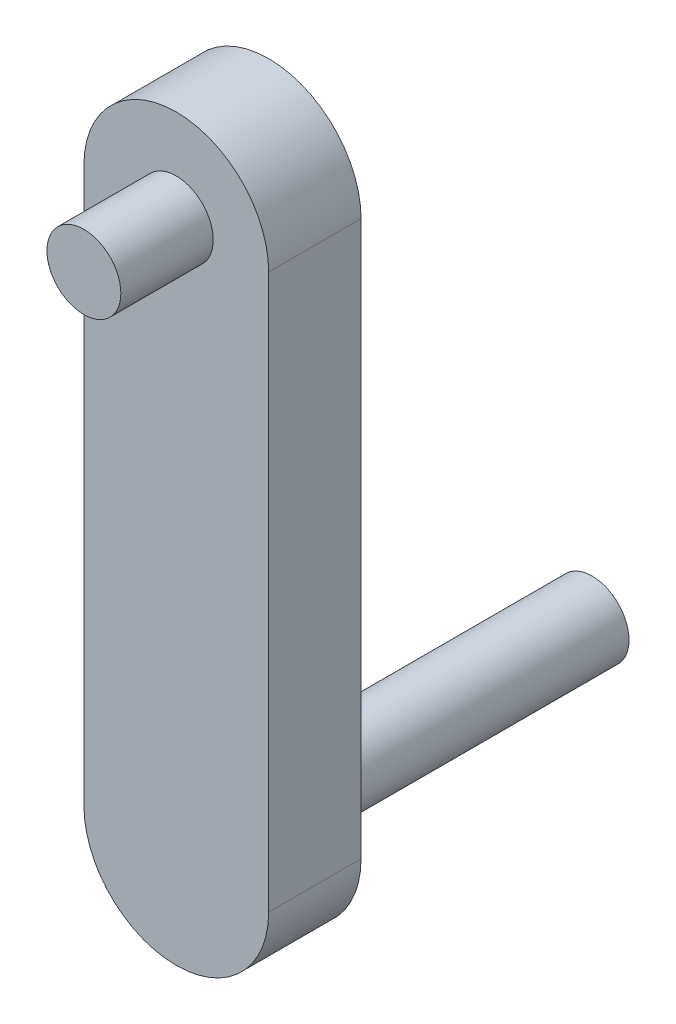
ISO-10303-21;
HEADER;
FILE_DESCRIPTION(('STEP AP214'),'2;1');
FILE_NAME('part.step','',(''),(''),'','','');
FILE_SCHEMA(('AUTOMOTIVE_DESIGN { 1 0 10303 214 1 1 1 1 }'));
ENDSEC;
DATA;
#1=APPLICATION_CONTEXT('core data for automotive mechanical design processes');
#2=APPLICATION_PROTOCOL_DEFINITION('international standard','automotive_design',2000,#1);
#3=PRODUCT_CONTEXT('',#1,'mechanical');
#4=PRODUCT('Part','Part','',(#3));
#5=PRODUCT_RELATED_PRODUCT_CATEGORY('part','',(#4));
#6=PRODUCT_DEFINITION_FORMATION('','',#4);
#7=PRODUCT_DEFINITION_CONTEXT('part definition',#1,'design');
#8=PRODUCT_DEFINITION('design','',#6,#7);
#9=PRODUCT_DEFINITION_SHAPE('','',#8);
#10=(LENGTH_UNIT() NAMED_UNIT(*) SI_UNIT(.MILLI.,.METRE.));
#11=(NAMED_UNIT(*) PLANE_ANGLE_UNIT() SI_UNIT($,.RADIAN.));
#12=(NAMED_UNIT(*) SI_UNIT($,.STERADIAN.) SOLID_ANGLE_UNIT());
#13=UNCERTAINTY_MEASURE_WITH_UNIT(LENGTH_MEASURE(1.E-05),#10,'distance_accuracy_value','');
#14=(GEOMETRIC_REPRESENTATION_CONTEXT(3) GLOBAL_UNCERTAINTY_ASSIGNED_CONTEXT((#13)) GLOBAL_UNIT_ASSIGNED_CONTEXT((#10,
#11,#12)) REPRESENTATION_CONTEXT('',''));
#15=CARTESIAN_POINT('',(0.,0.,0.));
#16=DIRECTION('',(0.,0.,1.));
#17=DIRECTION('',(1.,0.,0.));
#18=AXIS2_PLACEMENT_3D('',#15,#16,#17);
#19=CARTESIAN_POINT('',(0.,-30.,10.));
#20=DIRECTION('',(0.,0.,1.));
#21=DIRECTION('',(1.,0.,0.));
#22=AXIS2_PLACEMENT_3D('',#19,#20,#21);
#23=PLANE('',#22);
#24=CARTESIAN_POINT('',(0.,30.,10.));
#25=DIRECTION('',(0.,0.,1.));
#26=DIRECTION('',(1.,0.,0.));
#27=AXIS2_PLACEMENT_3D('',#24,#25,#26);
#28=CIRCLE('',#27,4.);
#29=CARTESIAN_POINT('',(4.,30.,10.));
#30=VERTEX_POINT('',#29);
#31=EDGE_CURVE('E115',#30,#30,#28,.T.);
#32=ORIENTED_EDGE('',*,*,#31,.F.);
#33=EDGE_LOOP('',(#32));
#34=FACE_BOUND('',#33,.T.);
#35=CARTESIAN_POINT('',(0.,-30.,10.));
#36=DIRECTION('',(0.,0.,1.));
#37=DIRECTION('',(1.,0.,0.));
#38=AXIS2_PLACEMENT_3D('',#35,#36,#37);
#39=CIRCLE('',#38,10.);
#40=CARTESIAN_POINT('',(-10.,-30.,10.));
#41=VERTEX_POINT('',#40);
#42=CARTESIAN_POINT('',(10.,-30.,10.));
#43=VERTEX_POINT('',#42);
#44=EDGE_CURVE('E95',#41,#43,#39,.T.);
#45=ORIENTED_EDGE('',*,*,#44,.T.);
#46=DIRECTION('',(0.,1.,0.));
#47=VECTOR('',#46,1.);
#48=CARTESIAN_POINT('',(10.,30.,10.));
#49=LINE('',#48,#47);
#50=CARTESIAN_POINT('',(10.,30.,10.));
#51=VERTEX_POINT('',#50);
#52=EDGE_CURVE('E91',#43,#51,#49,.T.);
#53=ORIENTED_EDGE('',*,*,#52,.T.);
#54=CARTESIAN_POINT('',(0.,30.,10.));
#55=DIRECTION('',(0.,0.,1.));
#56=DIRECTION('',(-1.,0.,0.));
#57=AXIS2_PLACEMENT_3D('',#54,#55,#56);
#58=CIRCLE('',#57,10.);
#59=CARTESIAN_POINT('',(-10.,30.,10.));
#60=VERTEX_POINT('',#59);
#61=EDGE_CURVE('E93',#51,#60,#58,.T.);
#62=ORIENTED_EDGE('',*,*,#61,.T.);
#63=DIRECTION('',(0.,-1.,0.));
#64=VECTOR('',#63,1.);
#65=CARTESIAN_POINT('',(-10.,30.,10.));
#66=LINE('',#65,#64);
#67=EDGE_CURVE('E61',#60,#41,#66,.T.);
#68=ORIENTED_EDGE('',*,*,#67,.T.);
#69=EDGE_LOOP('',(#45,#53,#62,#68));
#70=FACE_BOUND('',#69,.T.);
#71=ADVANCED_FACE('F43',(#34,#70),#23,.T.);
#72=CARTESIAN_POINT('',(0.,-30.,0.));
#73=DIRECTION('',(0.,0.,1.));
#74=DIRECTION('',(1.,0.,0.));
#75=AXIS2_PLACEMENT_3D('',#72,#73,#74);
#76=PLANE('',#75);
#77=CARTESIAN_POINT('',(0.,-30.,0.));
#78=DIRECTION('',(0.,0.,1.));
#79=DIRECTION('',(1.,0.,0.));
#80=AXIS2_PLACEMENT_3D('',#77,#78,#79);
#81=CIRCLE('',#80,10.);
#82=CARTESIAN_POINT('',(-10.,-30.,0.));
#83=VERTEX_POINT('',#82);
#84=CARTESIAN_POINT('',(10.,-30.,0.));
#85=VERTEX_POINT('',#84);
#86=EDGE_CURVE('E111',#83,#85,#81,.T.);
#87=ORIENTED_EDGE('',*,*,#86,.F.);
#88=DIRECTION('',(0.,-1.,0.));
#89=VECTOR('',#88,1.);
#90=CARTESIAN_POINT('',(-10.,30.,0.));
#91=LINE('',#90,#89);
#92=CARTESIAN_POINT('',(-10.,30.,0.));
#93=VERTEX_POINT('',#92);
#94=EDGE_CURVE('E84',#93,#83,#91,.T.);
#95=ORIENTED_EDGE('',*,*,#94,.F.);
#96=CARTESIAN_POINT('',(0.,30.,0.));
#97=DIRECTION('',(0.,0.,1.));
#98=DIRECTION('',(-1.,0.,0.));
#99=AXIS2_PLACEMENT_3D('',#96,#97,#98);
#100=CIRCLE('',#99,10.);
#101=CARTESIAN_POINT('',(10.,30.,0.));
#102=VERTEX_POINT('',#101);
#103=EDGE_CURVE('E78',#102,#93,#100,.T.);
#104=ORIENTED_EDGE('',*,*,#103,.F.);
#105=DIRECTION('',(0.,1.,0.));
#106=VECTOR('',#105,1.);
#107=CARTESIAN_POINT('',(10.,30.,0.));
#108=LINE('',#107,#106);
#109=EDGE_CURVE('E100',#85,#102,#108,.T.);
#110=ORIENTED_EDGE('',*,*,#109,.F.);
#111=EDGE_LOOP('',(#87,#95,#104,#110));
#112=FACE_BOUND('',#111,.T.);
#113=CARTESIAN_POINT('',(0.,-30.,0.));
#114=DIRECTION('',(0.,0.,1.));
#115=DIRECTION('',(1.,0.,0.));
#116=AXIS2_PLACEMENT_3D('',#113,#114,#115);
#117=CIRCLE('',#116,4.);
#118=CARTESIAN_POINT('',(4.00000000000001,-30.,0.));
#119=VERTEX_POINT('',#118);
#120=EDGE_CURVE('E140',#119,#119,#117,.F.);
#121=ORIENTED_EDGE('',*,*,#120,.F.);
#122=EDGE_LOOP('',(#121));
#123=FACE_BOUND('',#122,.T.);
#124=ADVANCED_FACE('F128',(#112,#123),#76,.F.);
#125=CARTESIAN_POINT('',(0.,-30.,10.));
#126=DIRECTION('',(0.,0.,-1.));
#127=DIRECTION('',(-1.,0.,0.));
#128=AXIS2_PLACEMENT_3D('',#125,#126,#127);
#129=CYLINDRICAL_SURFACE('',#128,10.);
#130=ORIENTED_EDGE('',*,*,#86,.T.);
#131=DIRECTION('',(0.,0.,-1.));
#132=VECTOR('',#131,1.);
#133=CARTESIAN_POINT('',(10.,-30.,10.));
#134=LINE('',#133,#132);
#135=EDGE_CURVE('E11',#43,#85,#134,.T.);
#136=ORIENTED_EDGE('',*,*,#135,.F.);
#137=ORIENTED_EDGE('',*,*,#44,.F.);
#138=DIRECTION('',(0.,0.,-1.));
#139=VECTOR('',#138,1.);
#140=CARTESIAN_POINT('',(-10.,-30.,10.));
#141=LINE('',#140,#139);
#142=EDGE_CURVE('E107',#41,#83,#141,.T.);
#143=ORIENTED_EDGE('',*,*,#142,.T.);
#144=EDGE_LOOP('',(#130,#136,#137,#143));
#145=FACE_BOUND('',#144,.T.);
#146=ADVANCED_FACE('F45',(#145),#129,.T.);
#147=CARTESIAN_POINT('',(10.,30.,10.));
#148=DIRECTION('',(-1.,0.,0.));
#149=DIRECTION('',(0.,-1.,0.));
#150=AXIS2_PLACEMENT_3D('',#147,#148,#149);
#151=PLANE('',#150);
#152=ORIENTED_EDGE('',*,*,#109,.T.);
#153=DIRECTION('',(0.,0.,-1.));
#154=VECTOR('',#153,1.);
#155=CARTESIAN_POINT('',(10.,30.,10.));
#156=LINE('',#155,#154);
#157=EDGE_CURVE('E53',#51,#102,#156,.T.);
#158=ORIENTED_EDGE('',*,*,#157,.F.);
#159=ORIENTED_EDGE('',*,*,#52,.F.);
#160=ORIENTED_EDGE('',*,*,#135,.T.);
#161=EDGE_LOOP('',(#152,#158,#159,#160));
#162=FACE_BOUND('',#161,.T.);
#163=ADVANCED_FACE('F99',(#162),#151,.F.);
#164=CARTESIAN_POINT('',(0.,30.,10.));
#165=DIRECTION('',(0.,0.,-1.));
#166=DIRECTION('',(-1.,0.,0.));
#167=AXIS2_PLACEMENT_3D('',#164,#165,#166);
#168=CYLINDRICAL_SURFACE('',#167,10.);
#169=ORIENTED_EDGE('',*,*,#103,.T.);
#170=DIRECTION('',(0.,0.,-1.));
#171=VECTOR('',#170,1.);
#172=CARTESIAN_POINT('',(-10.,30.,10.));
#173=LINE('',#172,#171);
#174=EDGE_CURVE('E102',#60,#93,#173,.T.);
#175=ORIENTED_EDGE('',*,*,#174,.F.);
#176=ORIENTED_EDGE('',*,*,#61,.F.);
#177=ORIENTED_EDGE('',*,*,#157,.T.);
#178=EDGE_LOOP('',(#169,#175,#176,#177));
#179=FACE_BOUND('',#178,.T.);
#180=ADVANCED_FACE('F103',(#179),#168,.T.);
#181=CARTESIAN_POINT('',(-10.,30.,10.));
#182=DIRECTION('',(1.,0.,0.));
#183=DIRECTION('',(0.,1.,0.));
#184=AXIS2_PLACEMENT_3D('',#181,#182,#183);
#185=PLANE('',#184);
#186=ORIENTED_EDGE('',*,*,#94,.T.);
#187=ORIENTED_EDGE('',*,*,#142,.F.);
#188=ORIENTED_EDGE('',*,*,#67,.F.);
#189=ORIENTED_EDGE('',*,*,#174,.T.);
#190=EDGE_LOOP('',(#186,#187,#188,#189));
#191=FACE_BOUND('',#190,.T.);
#192=ADVANCED_FACE('F125',(#191),#185,.F.);
#193=CARTESIAN_POINT('',(0.,30.,20.));
#194=DIRECTION('',(0.,0.,-1.));
#195=DIRECTION('',(-1.,0.,0.));
#196=AXIS2_PLACEMENT_3D('',#193,#194,#195);
#197=CYLINDRICAL_SURFACE('',#196,4.);
#198=ORIENTED_EDGE('',*,*,#31,.T.);
#199=EDGE_LOOP('',(#198));
#200=FACE_BOUND('',#199,.T.);
#201=CARTESIAN_POINT('',(0.,30.,20.));
#202=DIRECTION('',(0.,0.,1.));
#203=DIRECTION('',(1.,0.,0.));
#204=AXIS2_PLACEMENT_3D('',#201,#202,#203);
#205=CIRCLE('',#204,4.);
#206=CARTESIAN_POINT('',(4.,30.,20.));
#207=VERTEX_POINT('',#206);
#208=EDGE_CURVE('E136',#207,#207,#205,.T.);
#209=ORIENTED_EDGE('',*,*,#208,.F.);
#210=EDGE_LOOP('',(#209));
#211=FACE_BOUND('',#210,.T.);
#212=ADVANCED_FACE('F169',(#200,#211),#197,.T.);
#213=CARTESIAN_POINT('',(0.,0.,20.));
#214=DIRECTION('',(0.,0.,1.));
#215=DIRECTION('',(1.,0.,0.));
#216=AXIS2_PLACEMENT_3D('',#213,#214,#215);
#217=PLANE('',#216);
#218=ORIENTED_EDGE('',*,*,#208,.T.);
#219=EDGE_LOOP('',(#218));
#220=FACE_BOUND('',#219,.T.);
#221=ADVANCED_FACE('F158',(#220),#217,.T.);
#222=CARTESIAN_POINT('',(0.,-30.,21.3137084989848));
#223=DIRECTION('',(0.,0.,-1.));
#224=DIRECTION('',(-1.,0.,0.));
#225=AXIS2_PLACEMENT_3D('',#222,#223,#224);
#226=CYLINDRICAL_SURFACE('',#225,4.);
#227=CARTESIAN_POINT('',(0.,-30.,-35.));
#228=DIRECTION('',(0.,0.,1.));
#229=DIRECTION('',(1.,0.,0.));
#230=AXIS2_PLACEMENT_3D('',#227,#228,#229);
#231=CIRCLE('',#230,4.);
#232=CARTESIAN_POINT('',(4.00000000000001,-30.,-35.));
#233=VERTEX_POINT('',#232);
#234=EDGE_CURVE('E144',#233,#233,#231,.T.);
#235=ORIENTED_EDGE('',*,*,#234,.T.);
#236=EDGE_LOOP('',(#235));
#237=FACE_BOUND('',#236,.T.);
#238=ORIENTED_EDGE('',*,*,#120,.T.);
#239=EDGE_LOOP('',(#238));
#240=FACE_BOUND('',#239,.T.);
#241=ADVANCED_FACE('F149',(#237,#240),#226,.T.);
#242=CARTESIAN_POINT('',(0.,0.,-35.));
#243=DIRECTION('',(0.,0.,1.));
#244=DIRECTION('',(1.,0.,0.));
#245=AXIS2_PLACEMENT_3D('',#242,#243,#244);
#246=PLANE('',#245);
#247=ORIENTED_EDGE('',*,*,#234,.F.);
#248=EDGE_LOOP('',(#247));
#249=FACE_BOUND('',#248,.T.);
#250=ADVANCED_FACE('F152',(#249),#246,.F.);
#251=CLOSED_SHELL('',(#71,#124,#146,#163,#180,#192,#212,#221,#241,#250));
#252=MANIFOLD_SOLID_BREP('B2',#251);
#253=ADVANCED_BREP_SHAPE_REPRESENTATION('',(#18,#252),#14);
#254=SHAPE_DEFINITION_REPRESENTATION(#9,#253);
ENDSEC;
END-ISO-10303-21;
